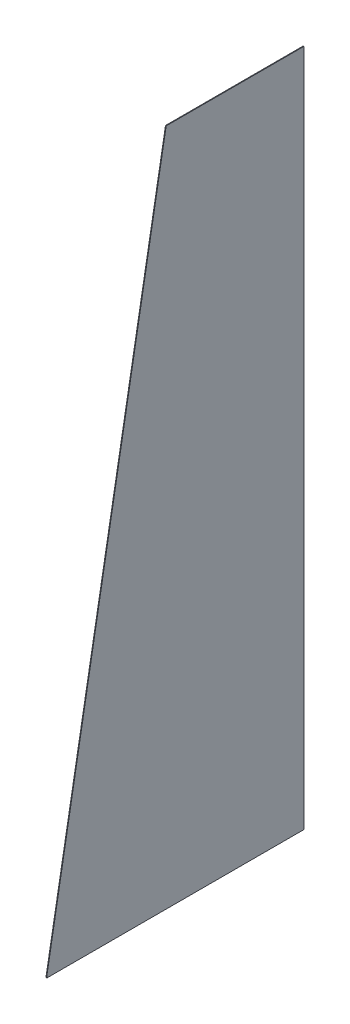
ISO-10303-21;
HEADER;
FILE_DESCRIPTION(('STEP AP214'),'2;1');
FILE_NAME('part.step','',(''),(''),'','','');
FILE_SCHEMA(('AUTOMOTIVE_DESIGN { 1 0 10303 214 1 1 1 1 }'));
ENDSEC;
DATA;
#1=APPLICATION_CONTEXT('core data for automotive mechanical design processes');
#2=APPLICATION_PROTOCOL_DEFINITION('international standard','automotive_design',2000,#1);
#3=PRODUCT_CONTEXT('',#1,'mechanical');
#4=PRODUCT('Part','Part','',(#3));
#5=PRODUCT_RELATED_PRODUCT_CATEGORY('part','',(#4));
#6=PRODUCT_DEFINITION_FORMATION('','',#4);
#7=PRODUCT_DEFINITION_CONTEXT('part definition',#1,'design');
#8=PRODUCT_DEFINITION('design','',#6,#7);
#9=PRODUCT_DEFINITION_SHAPE('','',#8);
#10=(LENGTH_UNIT() NAMED_UNIT(*) SI_UNIT(.MILLI.,.METRE.));
#11=(NAMED_UNIT(*) PLANE_ANGLE_UNIT() SI_UNIT($,.RADIAN.));
#12=(NAMED_UNIT(*) SI_UNIT($,.STERADIAN.) SOLID_ANGLE_UNIT());
#13=UNCERTAINTY_MEASURE_WITH_UNIT(LENGTH_MEASURE(1.E-05),#10,'distance_accuracy_value','');
#14=(GEOMETRIC_REPRESENTATION_CONTEXT(3) GLOBAL_UNCERTAINTY_ASSIGNED_CONTEXT((#13)) GLOBAL_UNIT_ASSIGNED_CONTEXT((#10,
#11,#12)) REPRESENTATION_CONTEXT('',''));
#15=CARTESIAN_POINT('',(0.,0.,0.));
#16=DIRECTION('',(0.,0.,1.));
#17=DIRECTION('',(1.,0.,0.));
#18=AXIS2_PLACEMENT_3D('',#15,#16,#17);
#19=CARTESIAN_POINT('',(-601.303406255924,1995.,-1070.));
#20=DIRECTION('',(0.,0.,1.));
#21=DIRECTION('',(1.,0.,0.));
#22=AXIS2_PLACEMENT_3D('',#19,#20,#21);
#23=PLANE('',#22);
#24=DIRECTION('',(-1.,0.,0.));
#25=VECTOR('',#24,1.);
#26=CARTESIAN_POINT('',(-601.303406255924,-1.96549319788491E-13,-1070.));
#27=LINE('',#26,#25);
#28=CARTESIAN_POINT('',(-601.303406255924,-1.96549319788491E-13,-1070.));
#29=VERTEX_POINT('',#28);
#30=CARTESIAN_POINT('',(-603.303406255924,-1.96549319788491E-13,-1070.));
#31=VERTEX_POINT('',#30);
#32=EDGE_CURVE('E78',#29,#31,#27,.T.);
#33=ORIENTED_EDGE('',*,*,#32,.T.);
#34=DIRECTION('',(0.,-1.,0.));
#35=VECTOR('',#34,1.);
#36=CARTESIAN_POINT('',(-603.303406255924,1995.,-1070.));
#37=LINE('',#36,#35);
#38=CARTESIAN_POINT('',(-603.303406255924,1995.,-1070.));
#39=VERTEX_POINT('',#38);
#40=EDGE_CURVE('E24',#39,#31,#37,.T.);
#41=ORIENTED_EDGE('',*,*,#40,.F.);
#42=DIRECTION('',(-1.,0.,0.));
#43=VECTOR('',#42,1.);
#44=CARTESIAN_POINT('',(-601.303406255924,1995.,-1070.));
#45=LINE('',#44,#43);
#46=CARTESIAN_POINT('',(-601.303406255924,1995.,-1070.));
#47=VERTEX_POINT('',#46);
#48=EDGE_CURVE('E89',#47,#39,#45,.T.);
#49=ORIENTED_EDGE('',*,*,#48,.F.);
#50=DIRECTION('',(0.,-1.,0.));
#51=VECTOR('',#50,1.);
#52=CARTESIAN_POINT('',(-601.303406255924,1995.,-1070.));
#53=LINE('',#52,#51);
#54=EDGE_CURVE('E96',#47,#29,#53,.T.);
#55=ORIENTED_EDGE('',*,*,#54,.T.);
#56=EDGE_LOOP('',(#33,#41,#49,#55));
#57=FACE_BOUND('',#56,.T.);
#58=ADVANCED_FACE('F17',(#57),#23,.F.);
#59=CARTESIAN_POINT('',(-603.303406255924,1995.,-1070.));
#60=DIRECTION('',(1.,0.,0.));
#61=DIRECTION('',(0.,0.,-1.));
#62=AXIS2_PLACEMENT_3D('',#59,#60,#61);
#63=PLANE('',#62);
#64=DIRECTION('',(0.,-1.,0.));
#65=VECTOR('',#64,1.);
#66=CARTESIAN_POINT('',(-603.303406255924,1995.,-314.228));
#67=LINE('',#66,#65);
#68=CARTESIAN_POINT('',(-603.303406255924,5.00185174943479,-314.228));
#69=VERTEX_POINT('',#68);
#70=CARTESIAN_POINT('',(-603.303406255924,0.,-314.228));
#71=VERTEX_POINT('',#70);
#72=EDGE_CURVE('E76',#69,#71,#67,.T.);
#73=ORIENTED_EDGE('',*,*,#72,.F.);
#74=DIRECTION('',(0.,0.984807753012208,-0.17364817766693));
#75=VECTOR('',#74,1.);
#76=CARTESIAN_POINT('',(-603.303406255924,2064.23883739982,-677.327040242932));
#77=LINE('',#76,#75);
#78=CARTESIAN_POINT('',(-603.303406255924,1995.,-665.118365096458));
#79=VERTEX_POINT('',#78);
#80=EDGE_CURVE('E31',#69,#79,#77,.T.);
#81=ORIENTED_EDGE('',*,*,#80,.T.);
#82=DIRECTION('',(0.,0.,1.));
#83=VECTOR('',#82,1.);
#84=CARTESIAN_POINT('',(-603.303406255924,1995.,-1070.));
#85=LINE('',#84,#83);
#86=EDGE_CURVE('E92',#39,#79,#85,.T.);
#87=ORIENTED_EDGE('',*,*,#86,.F.);
#88=ORIENTED_EDGE('',*,*,#40,.T.);
#89=DIRECTION('',(0.,0.,1.));
#90=VECTOR('',#89,1.);
#91=CARTESIAN_POINT('',(-603.303406255924,-1.96549319788491E-13,-1070.));
#92=LINE('',#91,#90);
#93=EDGE_CURVE('E84',#31,#71,#92,.T.);
#94=ORIENTED_EDGE('',*,*,#93,.T.);
#95=EDGE_LOOP('',(#73,#81,#87,#88,#94));
#96=FACE_BOUND('',#95,.T.);
#97=ADVANCED_FACE('F102',(#96),#63,.F.);
#98=CARTESIAN_POINT('',(-601.303406255924,1995.,-690.));
#99=DIRECTION('',(-1.,0.,0.));
#100=DIRECTION('',(0.,0.,1.));
#101=AXIS2_PLACEMENT_3D('',#98,#99,#100);
#102=PLANE('',#101);
#103=DIRECTION('',(0.,0.,-1.));
#104=VECTOR('',#103,1.);
#105=CARTESIAN_POINT('',(-601.303406255924,1995.,-690.));
#106=LINE('',#105,#104);
#107=CARTESIAN_POINT('',(-601.303406255924,1995.,-665.118365096458));
#108=VERTEX_POINT('',#107);
#109=EDGE_CURVE('E38',#108,#47,#106,.T.);
#110=ORIENTED_EDGE('',*,*,#109,.F.);
#111=DIRECTION('',(0.,-0.984807753012208,0.17364817766693));
#112=VECTOR('',#111,1.);
#113=CARTESIAN_POINT('',(-601.303406255924,1999.25501016794,-665.868638192255));
#114=LINE('',#113,#112);
#115=CARTESIAN_POINT('',(-601.303406255924,5.00185174943479,-314.228));
#116=VERTEX_POINT('',#115);
#117=EDGE_CURVE('E63',#108,#116,#114,.T.);
#118=ORIENTED_EDGE('',*,*,#117,.T.);
#119=DIRECTION('',(0.,-1.,0.));
#120=VECTOR('',#119,1.);
#121=CARTESIAN_POINT('',(-601.303406255924,1995.,-314.228));
#122=LINE('',#121,#120);
#123=CARTESIAN_POINT('',(-601.303406255924,0.,-314.228));
#124=VERTEX_POINT('',#123);
#125=EDGE_CURVE('E69',#116,#124,#122,.T.);
#126=ORIENTED_EDGE('',*,*,#125,.T.);
#127=DIRECTION('',(0.,0.,-1.));
#128=VECTOR('',#127,1.);
#129=CARTESIAN_POINT('',(-601.303406255924,-1.26746757620616E-13,-690.));
#130=LINE('',#129,#128);
#131=EDGE_CURVE('E87',#124,#29,#130,.T.);
#132=ORIENTED_EDGE('',*,*,#131,.T.);
#133=ORIENTED_EDGE('',*,*,#54,.F.);
#134=EDGE_LOOP('',(#110,#118,#126,#132,#133));
#135=FACE_BOUND('',#134,.T.);
#136=ADVANCED_FACE('F68',(#135),#102,.F.);
#137=CARTESIAN_POINT('',(-603.303406255924,1995.,-1070.));
#138=DIRECTION('',(0.,1.,0.));
#139=DIRECTION('',(-1.,0.,0.));
#140=AXIS2_PLACEMENT_3D('',#137,#138,#139);
#141=PLANE('',#140);
#142=DIRECTION('',(-1.,0.,0.));
#143=VECTOR('',#142,1.);
#144=CARTESIAN_POINT('',(-603.303406255924,1995.,-665.118365096458));
#145=LINE('',#144,#143);
#146=EDGE_CURVE('E80',#108,#79,#145,.T.);
#147=ORIENTED_EDGE('',*,*,#146,.F.);
#148=ORIENTED_EDGE('',*,*,#109,.T.);
#149=ORIENTED_EDGE('',*,*,#48,.T.);
#150=ORIENTED_EDGE('',*,*,#86,.T.);
#151=EDGE_LOOP('',(#147,#148,#149,#150));
#152=FACE_BOUND('',#151,.T.);
#153=ADVANCED_FACE('F108',(#152),#141,.T.);
#154=CARTESIAN_POINT('',(-603.303406255924,-1.96549319788491E-13,-1070.));
#155=DIRECTION('',(0.,1.,0.));
#156=DIRECTION('',(-1.,0.,0.));
#157=AXIS2_PLACEMENT_3D('',#154,#155,#156);
#158=PLANE('',#157);
#159=ORIENTED_EDGE('',*,*,#32,.F.);
#160=ORIENTED_EDGE('',*,*,#131,.F.);
#161=DIRECTION('',(1.,0.,0.));
#162=VECTOR('',#161,1.);
#163=CARTESIAN_POINT('',(-603.303406255924,0.,-314.228));
#164=LINE('',#163,#162);
#165=EDGE_CURVE('E75',#71,#124,#164,.T.);
#166=ORIENTED_EDGE('',*,*,#165,.F.);
#167=ORIENTED_EDGE('',*,*,#93,.F.);
#168=EDGE_LOOP('',(#159,#160,#166,#167));
#169=FACE_BOUND('',#168,.T.);
#170=ADVANCED_FACE('F107',(#169),#158,.F.);
#171=CARTESIAN_POINT('',(-603.303406255924,1995.,-314.228));
#172=DIRECTION('',(0.,0.,-1.));
#173=DIRECTION('',(-1.,0.,0.));
#174=AXIS2_PLACEMENT_3D('',#171,#172,#173);
#175=PLANE('',#174);
#176=ORIENTED_EDGE('',*,*,#125,.F.);
#177=DIRECTION('',(-1.,0.,0.));
#178=VECTOR('',#177,1.);
#179=CARTESIAN_POINT('',(-603.303406255924,5.00185174943479,-314.228));
#180=LINE('',#179,#178);
#181=EDGE_CURVE('E11',#116,#69,#180,.T.);
#182=ORIENTED_EDGE('',*,*,#181,.T.);
#183=ORIENTED_EDGE('',*,*,#72,.T.);
#184=ORIENTED_EDGE('',*,*,#165,.T.);
#185=EDGE_LOOP('',(#176,#182,#183,#184));
#186=FACE_BOUND('',#185,.T.);
#187=ADVANCED_FACE('F73',(#186),#175,.F.);
#188=CARTESIAN_POINT('',(-680.,4.99999999999946,-314.227673486614));
#189=DIRECTION('',(0.,-0.17364817766693,-0.984807753012208));
#190=DIRECTION('',(0.,-0.984807753012208,0.17364817766693));
#191=AXIS2_PLACEMENT_3D('',#188,#189,#190);
#192=PLANE('',#191);
#193=ORIENTED_EDGE('',*,*,#117,.F.);
#194=ORIENTED_EDGE('',*,*,#146,.T.);
#195=ORIENTED_EDGE('',*,*,#80,.F.);
#196=ORIENTED_EDGE('',*,*,#181,.F.);
#197=EDGE_LOOP('',(#193,#194,#195,#196));
#198=FACE_BOUND('',#197,.T.);
#199=ADVANCED_FACE('F62',(#198),#192,.F.);
#200=CLOSED_SHELL('',(#58,#97,#136,#153,#170,#187,#199));
#201=MANIFOLD_SOLID_BREP('B1',#200);
#202=ADVANCED_BREP_SHAPE_REPRESENTATION('',(#18,#201),#14);
#203=SHAPE_DEFINITION_REPRESENTATION(#9,#202);
ENDSEC;
END-ISO-10303-21;
